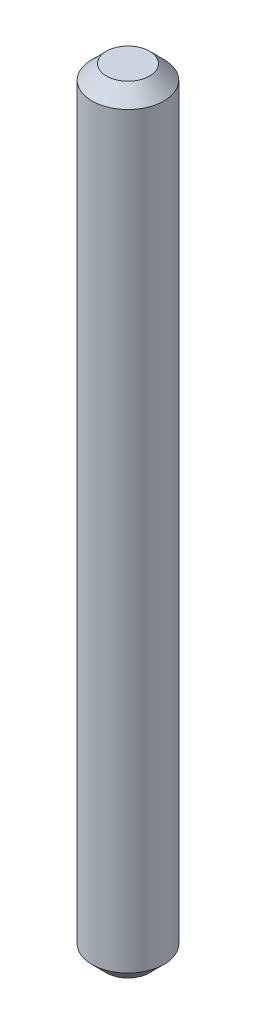
ISO-10303-21;
HEADER;
FILE_DESCRIPTION(('STEP AP214'),'2;1');
FILE_NAME('part.step','',(''),(''),'','','');
FILE_SCHEMA(('AUTOMOTIVE_DESIGN { 1 0 10303 214 1 1 1 1 }'));
ENDSEC;
DATA;
#1=APPLICATION_CONTEXT('core data for automotive mechanical design processes');
#2=APPLICATION_PROTOCOL_DEFINITION('international standard','automotive_design',2000,#1);
#3=PRODUCT_CONTEXT('',#1,'mechanical');
#4=PRODUCT('Part','Part','',(#3));
#5=PRODUCT_RELATED_PRODUCT_CATEGORY('part','',(#4));
#6=PRODUCT_DEFINITION_FORMATION('','',#4);
#7=PRODUCT_DEFINITION_CONTEXT('part definition',#1,'design');
#8=PRODUCT_DEFINITION('design','',#6,#7);
#9=PRODUCT_DEFINITION_SHAPE('','',#8);
#10=(LENGTH_UNIT() NAMED_UNIT(*) SI_UNIT(.MILLI.,.METRE.));
#11=(NAMED_UNIT(*) PLANE_ANGLE_UNIT() SI_UNIT($,.RADIAN.));
#12=(NAMED_UNIT(*) SI_UNIT($,.STERADIAN.) SOLID_ANGLE_UNIT());
#13=UNCERTAINTY_MEASURE_WITH_UNIT(LENGTH_MEASURE(1.E-05),#10,'distance_accuracy_value','');
#14=(GEOMETRIC_REPRESENTATION_CONTEXT(3) GLOBAL_UNCERTAINTY_ASSIGNED_CONTEXT((#13)) GLOBAL_UNIT_ASSIGNED_CONTEXT((#10,
#11,#12)) REPRESENTATION_CONTEXT('',''));
#15=CARTESIAN_POINT('',(0.,0.,0.));
#16=DIRECTION('',(0.,0.,1.));
#17=DIRECTION('',(1.,0.,0.));
#18=AXIS2_PLACEMENT_3D('',#15,#16,#17);
#19=CARTESIAN_POINT('',(0.,54.,0.));
#20=DIRECTION('',(0.,-1.,0.));
#21=DIRECTION('',(0.,0.,-1.));
#22=AXIS2_PLACEMENT_3D('',#19,#20,#21);
#23=CYLINDRICAL_SURFACE('',#22,2.5);
#24=CARTESIAN_POINT('',(0.,1.00000000000001,0.));
#25=DIRECTION('',(0.,1.,0.));
#26=DIRECTION('',(0.,0.,1.));
#27=AXIS2_PLACEMENT_3D('',#24,#25,#26);
#28=CIRCLE('',#27,2.5);
#29=CARTESIAN_POINT('',(0.,1.00000000000001,2.5));
#30=VERTEX_POINT('',#29);
#31=EDGE_CURVE('E55',#30,#30,#28,.T.);
#32=ORIENTED_EDGE('',*,*,#31,.T.);
#33=EDGE_LOOP('',(#32));
#34=FACE_BOUND('',#33,.T.);
#35=CARTESIAN_POINT('',(0.,53.,0.));
#36=DIRECTION('',(0.,1.,0.));
#37=DIRECTION('',(0.,0.,1.));
#38=AXIS2_PLACEMENT_3D('',#35,#36,#37);
#39=CIRCLE('',#38,2.5);
#40=CARTESIAN_POINT('',(0.,53.,2.5));
#41=VERTEX_POINT('',#40);
#42=EDGE_CURVE('E60',#41,#41,#39,.F.);
#43=ORIENTED_EDGE('',*,*,#42,.T.);
#44=EDGE_LOOP('',(#43));
#45=FACE_BOUND('',#44,.T.);
#46=ADVANCED_FACE('F41',(#34,#45),#23,.T.);
#47=CARTESIAN_POINT('',(0.,54.,0.));
#48=DIRECTION('',(0.,1.,0.));
#49=DIRECTION('',(0.,0.,1.));
#50=AXIS2_PLACEMENT_3D('',#47,#48,#49);
#51=PLANE('',#50);
#52=CARTESIAN_POINT('',(0.,54.,0.));
#53=DIRECTION('',(0.,1.,0.));
#54=DIRECTION('',(0.,0.,1.));
#55=AXIS2_PLACEMENT_3D('',#52,#53,#54);
#56=CIRCLE('',#55,1.5);
#57=CARTESIAN_POINT('',(0.,54.,1.5));
#58=VERTEX_POINT('',#57);
#59=EDGE_CURVE('E10',#58,#58,#56,.T.);
#60=ORIENTED_EDGE('',*,*,#59,.T.);
#61=EDGE_LOOP('',(#60));
#62=FACE_BOUND('',#61,.T.);
#63=ADVANCED_FACE('F77',(#62),#51,.T.);
#64=CARTESIAN_POINT('',(0.,0.,0.));
#65=DIRECTION('',(0.,1.,0.));
#66=DIRECTION('',(0.,0.,1.));
#67=AXIS2_PLACEMENT_3D('',#64,#65,#66);
#68=PLANE('',#67);
#69=CARTESIAN_POINT('',(0.,0.,0.));
#70=DIRECTION('',(0.,1.,0.));
#71=DIRECTION('',(0.,0.,1.));
#72=AXIS2_PLACEMENT_3D('',#69,#70,#71);
#73=CIRCLE('',#72,1.49999999999999);
#74=CARTESIAN_POINT('',(0.,0.,1.49999999999999));
#75=VERTEX_POINT('',#74);
#76=EDGE_CURVE('E50',#75,#75,#73,.F.);
#77=ORIENTED_EDGE('',*,*,#76,.T.);
#78=EDGE_LOOP('',(#77));
#79=FACE_BOUND('',#78,.T.);
#80=ADVANCED_FACE('F74',(#79),#68,.F.);
#81=CARTESIAN_POINT('',(0.,1.00000000000001,0.));
#82=DIRECTION('',(0.,1.,0.));
#83=DIRECTION('',(0.,0.,1.));
#84=AXIS2_PLACEMENT_3D('',#81,#82,#83);
#85=CONICAL_SURFACE('',#84,2.5,0.785398163397451);
#86=ORIENTED_EDGE('',*,*,#76,.F.);
#87=EDGE_LOOP('',(#86));
#88=FACE_BOUND('',#87,.T.);
#89=ORIENTED_EDGE('',*,*,#31,.F.);
#90=EDGE_LOOP('',(#89));
#91=FACE_BOUND('',#90,.T.);
#92=ADVANCED_FACE('F70',(#88,#91),#85,.T.);
#93=CARTESIAN_POINT('',(0.,54.,0.));
#94=DIRECTION('',(0.,-1.,0.));
#95=DIRECTION('',(0.,0.,-1.));
#96=AXIS2_PLACEMENT_3D('',#93,#94,#95);
#97=CONICAL_SURFACE('',#96,1.5,0.785398163397444);
#98=ORIENTED_EDGE('',*,*,#42,.F.);
#99=EDGE_LOOP('',(#98));
#100=FACE_BOUND('',#99,.T.);
#101=ORIENTED_EDGE('',*,*,#59,.F.);
#102=EDGE_LOOP('',(#101));
#103=FACE_BOUND('',#102,.T.);
#104=ADVANCED_FACE('F44',(#100,#103),#97,.T.);
#105=CLOSED_SHELL('',(#46,#63,#80,#92,#104));
#106=MANIFOLD_SOLID_BREP('B2',#105);
#107=ADVANCED_BREP_SHAPE_REPRESENTATION('',(#18,#106),#14);
#108=SHAPE_DEFINITION_REPRESENTATION(#9,#107);
ENDSEC;
END-ISO-10303-21;
